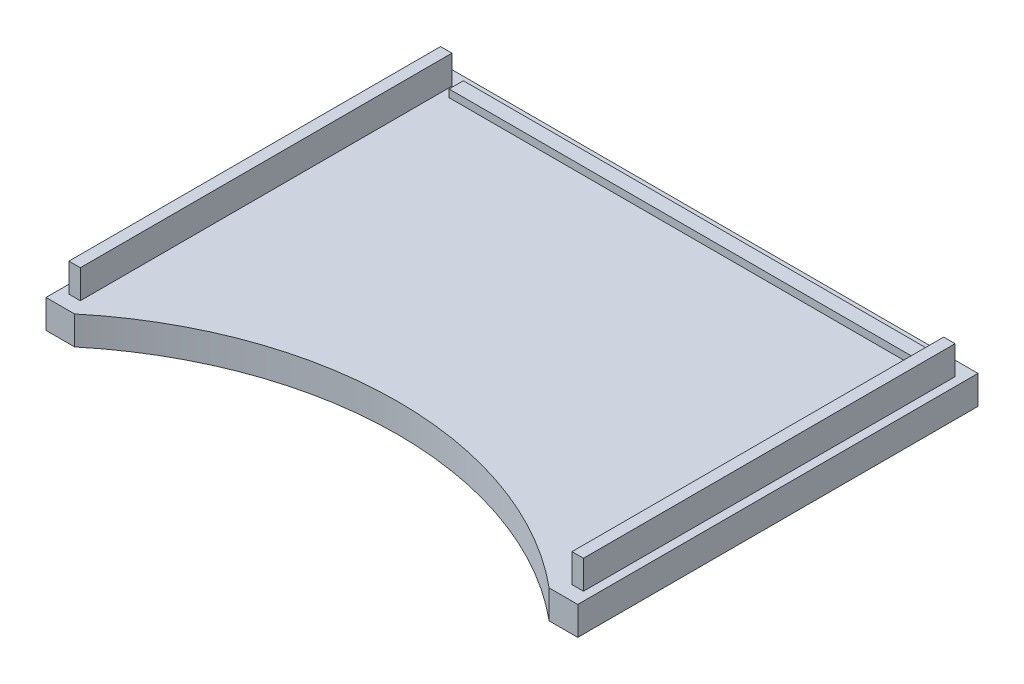
ISO-10303-21;
HEADER;
FILE_DESCRIPTION(('STEP AP214'),'2;1');
FILE_NAME('part.step','',(''),(''),'','','');
FILE_SCHEMA(('AUTOMOTIVE_DESIGN { 1 0 10303 214 1 1 1 1 }'));
ENDSEC;
DATA;
#1=APPLICATION_CONTEXT('core data for automotive mechanical design processes');
#2=APPLICATION_PROTOCOL_DEFINITION('international standard','automotive_design',2000,#1);
#3=PRODUCT_CONTEXT('',#1,'mechanical');
#4=PRODUCT('Part','Part','',(#3));
#5=PRODUCT_RELATED_PRODUCT_CATEGORY('part','',(#4));
#6=PRODUCT_DEFINITION_FORMATION('','',#4);
#7=PRODUCT_DEFINITION_CONTEXT('part definition',#1,'design');
#8=PRODUCT_DEFINITION('design','',#6,#7);
#9=PRODUCT_DEFINITION_SHAPE('','',#8);
#10=(LENGTH_UNIT() NAMED_UNIT(*) SI_UNIT(.MILLI.,.METRE.));
#11=(NAMED_UNIT(*) PLANE_ANGLE_UNIT() SI_UNIT($,.RADIAN.));
#12=(NAMED_UNIT(*) SI_UNIT($,.STERADIAN.) SOLID_ANGLE_UNIT());
#13=UNCERTAINTY_MEASURE_WITH_UNIT(LENGTH_MEASURE(1.E-05),#10,'distance_accuracy_value','');
#14=(GEOMETRIC_REPRESENTATION_CONTEXT(3) GLOBAL_UNCERTAINTY_ASSIGNED_CONTEXT((#13)) GLOBAL_UNIT_ASSIGNED_CONTEXT((#10,
#11,#12)) REPRESENTATION_CONTEXT('',''));
#15=CARTESIAN_POINT('',(0.,0.,0.));
#16=DIRECTION('',(0.,0.,1.));
#17=DIRECTION('',(1.,0.,0.));
#18=AXIS2_PLACEMENT_3D('',#15,#16,#17);
#19=CARTESIAN_POINT('',(0.,10.,0.));
#20=DIRECTION('',(0.,-1.,0.));
#21=DIRECTION('',(0.,0.,-1.));
#22=AXIS2_PLACEMENT_3D('',#19,#20,#21);
#23=PLANE('',#22);
#24=DIRECTION('',(0.,0.,1.));
#25=VECTOR('',#24,1.);
#26=CARTESIAN_POINT('',(179.,10.,-135.));
#27=LINE('',#26,#25);
#28=CARTESIAN_POINT('',(179.,10.,-135.));
#29=VERTEX_POINT('',#28);
#30=CARTESIAN_POINT('',(179.,10.,-5.));
#31=VERTEX_POINT('',#30);
#32=EDGE_CURVE('E181',#29,#31,#27,.T.);
#33=ORIENTED_EDGE('',*,*,#32,.F.);
#34=DIRECTION('',(-1.,0.,0.));
#35=VECTOR('',#34,1.);
#36=CARTESIAN_POINT('',(179.,10.,-135.));
#37=LINE('',#36,#35);
#38=CARTESIAN_POINT('',(183.,10.,-135.));
#39=VERTEX_POINT('',#38);
#40=EDGE_CURVE('E194',#39,#29,#37,.T.);
#41=ORIENTED_EDGE('',*,*,#40,.F.);
#42=DIRECTION('',(0.,0.,-1.));
#43=VECTOR('',#42,1.);
#44=CARTESIAN_POINT('',(183.,10.,-135.));
#45=LINE('',#44,#43);
#46=CARTESIAN_POINT('',(183.,10.,-5.));
#47=VERTEX_POINT('',#46);
#48=EDGE_CURVE('E203',#47,#39,#45,.T.);
#49=ORIENTED_EDGE('',*,*,#48,.F.);
#50=DIRECTION('',(1.,0.,0.));
#51=VECTOR('',#50,1.);
#52=CARTESIAN_POINT('',(179.,10.,-5.));
#53=LINE('',#52,#51);
#54=EDGE_CURVE('E184',#31,#47,#53,.T.);
#55=ORIENTED_EDGE('',*,*,#54,.F.);
#56=EDGE_LOOP('',(#33,#41,#49,#55));
#57=FACE_BOUND('',#56,.T.);
#58=DIRECTION('',(1.,0.,0.));
#59=VECTOR('',#58,1.);
#60=CARTESIAN_POINT('',(0.,10.,0.));
#61=LINE('',#60,#59);
#62=CARTESIAN_POINT('',(0.,10.,0.));
#63=VERTEX_POINT('',#62);
#64=CARTESIAN_POINT('',(10.,10.,0.));
#65=VERTEX_POINT('',#64);
#66=EDGE_CURVE('E268',#63,#65,#61,.T.);
#67=ORIENTED_EDGE('',*,*,#66,.T.);
#68=CARTESIAN_POINT('',(93.,10.,99.8166666666667));
#69=DIRECTION('',(0.,1.,0.));
#70=DIRECTION('',(0.,0.,-1.));
#71=AXIS2_PLACEMENT_3D('',#68,#69,#70);
#72=CIRCLE('',#71,129.816666666667);
#73=CARTESIAN_POINT('',(176.,10.,0.));
#74=VERTEX_POINT('',#73);
#75=EDGE_CURVE('E252',#74,#65,#72,.T.);
#76=ORIENTED_EDGE('',*,*,#75,.F.);
#77=CARTESIAN_POINT('',(186.,10.,0.));
#78=VERTEX_POINT('',#77);
#79=EDGE_CURVE('E266',#74,#78,#61,.T.);
#80=ORIENTED_EDGE('',*,*,#79,.T.);
#81=DIRECTION('',(0.,0.,-1.));
#82=VECTOR('',#81,1.);
#83=CARTESIAN_POINT('',(186.,10.,0.));
#84=LINE('',#83,#82);
#85=CARTESIAN_POINT('',(186.,10.,-140.));
#86=VERTEX_POINT('',#85);
#87=EDGE_CURVE('E271',#78,#86,#84,.T.);
#88=ORIENTED_EDGE('',*,*,#87,.T.);
#89=DIRECTION('',(-1.,0.,0.));
#90=VECTOR('',#89,1.);
#91=CARTESIAN_POINT('',(0.,10.,-140.));
#92=LINE('',#91,#90);
#93=CARTESIAN_POINT('',(0.,10.,-140.));
#94=VERTEX_POINT('',#93);
#95=EDGE_CURVE('E273',#86,#94,#92,.T.);
#96=ORIENTED_EDGE('',*,*,#95,.T.);
#97=DIRECTION('',(0.,0.,1.));
#98=VECTOR('',#97,1.);
#99=CARTESIAN_POINT('',(0.,10.,0.));
#100=LINE('',#99,#98);
#101=EDGE_CURVE('E263',#94,#63,#100,.T.);
#102=ORIENTED_EDGE('',*,*,#101,.T.);
#103=EDGE_LOOP('',(#67,#76,#80,#88,#96,#102));
#104=FACE_BOUND('',#103,.T.);
#105=DIRECTION('',(0.,0.,1.));
#106=VECTOR('',#105,1.);
#107=CARTESIAN_POINT('',(10.,10.,-136.));
#108=LINE('',#107,#106);
#109=CARTESIAN_POINT('',(10.,10.,-136.));
#110=VERTEX_POINT('',#109);
#111=CARTESIAN_POINT('',(10.,10.,-131.));
#112=VERTEX_POINT('',#111);
#113=EDGE_CURVE('E219',#110,#112,#108,.T.);
#114=ORIENTED_EDGE('',*,*,#113,.F.);
#115=DIRECTION('',(-1.,0.,0.));
#116=VECTOR('',#115,1.);
#117=CARTESIAN_POINT('',(10.,10.,-136.));
#118=LINE('',#117,#116);
#119=CARTESIAN_POINT('',(176.,10.,-136.));
#120=VERTEX_POINT('',#119);
#121=EDGE_CURVE('E224',#120,#110,#118,.T.);
#122=ORIENTED_EDGE('',*,*,#121,.F.);
#123=DIRECTION('',(0.,0.,-1.));
#124=VECTOR('',#123,1.);
#125=CARTESIAN_POINT('',(176.,10.,-136.));
#126=LINE('',#125,#124);
#127=CARTESIAN_POINT('',(176.,10.,-131.));
#128=VERTEX_POINT('',#127);
#129=EDGE_CURVE('E236',#128,#120,#126,.T.);
#130=ORIENTED_EDGE('',*,*,#129,.F.);
#131=DIRECTION('',(1.,0.,0.));
#132=VECTOR('',#131,1.);
#133=CARTESIAN_POINT('',(10.,10.,-131.));
#134=LINE('',#133,#132);
#135=EDGE_CURVE('E233',#112,#128,#134,.T.);
#136=ORIENTED_EDGE('',*,*,#135,.F.);
#137=EDGE_LOOP('',(#114,#122,#130,#136));
#138=FACE_BOUND('',#137,.T.);
#139=DIRECTION('',(0.,0.,1.));
#140=VECTOR('',#139,1.);
#141=CARTESIAN_POINT('',(3.,10.,-135.));
#142=LINE('',#141,#140);
#143=CARTESIAN_POINT('',(3.,10.,-135.));
#144=VERTEX_POINT('',#143);
#145=CARTESIAN_POINT('',(3.00000000000002,10.,-5.));
#146=VERTEX_POINT('',#145);
#147=EDGE_CURVE('E180',#144,#146,#142,.T.);
#148=ORIENTED_EDGE('',*,*,#147,.F.);
#149=DIRECTION('',(-1.,0.,0.));
#150=VECTOR('',#149,1.);
#151=CARTESIAN_POINT('',(3.,10.,-135.));
#152=LINE('',#151,#150);
#153=CARTESIAN_POINT('',(7.,10.,-135.));
#154=VERTEX_POINT('',#153);
#155=EDGE_CURVE('E177',#154,#144,#152,.T.);
#156=ORIENTED_EDGE('',*,*,#155,.F.);
#157=DIRECTION('',(0.,0.,-1.));
#158=VECTOR('',#157,1.);
#159=CARTESIAN_POINT('',(7.,10.,-135.));
#160=LINE('',#159,#158);
#161=CARTESIAN_POINT('',(7.00000000000002,10.,-5.));
#162=VERTEX_POINT('',#161);
#163=EDGE_CURVE('E55',#162,#154,#160,.T.);
#164=ORIENTED_EDGE('',*,*,#163,.F.);
#165=DIRECTION('',(1.,0.,0.));
#166=VECTOR('',#165,1.);
#167=CARTESIAN_POINT('',(3.00000000000002,10.,-5.));
#168=LINE('',#167,#166);
#169=EDGE_CURVE('E50',#146,#162,#168,.T.);
#170=ORIENTED_EDGE('',*,*,#169,.F.);
#171=EDGE_LOOP('',(#148,#156,#164,#170));
#172=FACE_BOUND('',#171,.T.);
#173=ADVANCED_FACE('F35',(#57,#104,#138,#172),#23,.F.);
#174=CARTESIAN_POINT('',(0.,10.,0.));
#175=DIRECTION('',(0.,0.,-1.));
#176=DIRECTION('',(-1.,0.,0.));
#177=AXIS2_PLACEMENT_3D('',#174,#175,#176);
#178=PLANE('',#177);
#179=DIRECTION('',(1.,0.,0.));
#180=VECTOR('',#179,1.);
#181=CARTESIAN_POINT('',(0.,0.,0.));
#182=LINE('',#181,#180);
#183=CARTESIAN_POINT('',(0.,0.,0.));
#184=VERTEX_POINT('',#183);
#185=CARTESIAN_POINT('',(10.,0.,0.));
#186=VERTEX_POINT('',#185);
#187=EDGE_CURVE('E279',#184,#186,#182,.T.);
#188=ORIENTED_EDGE('',*,*,#187,.T.);
#189=DIRECTION('',(0.,1.,0.));
#190=VECTOR('',#189,1.);
#191=CARTESIAN_POINT('',(10.,0.,0.));
#192=LINE('',#191,#190);
#193=EDGE_CURVE('E256',#186,#65,#192,.T.);
#194=ORIENTED_EDGE('',*,*,#193,.T.);
#195=ORIENTED_EDGE('',*,*,#66,.F.);
#196=DIRECTION('',(0.,-1.,0.));
#197=VECTOR('',#196,1.);
#198=CARTESIAN_POINT('',(0.,10.,0.));
#199=LINE('',#198,#197);
#200=EDGE_CURVE('E11',#63,#184,#199,.T.);
#201=ORIENTED_EDGE('',*,*,#200,.T.);
#202=EDGE_LOOP('',(#188,#194,#195,#201));
#203=FACE_BOUND('',#202,.T.);
#204=ADVANCED_FACE('F318',(#203),#178,.F.);
#205=CARTESIAN_POINT('',(0.,10.,0.));
#206=DIRECTION('',(1.,0.,0.));
#207=DIRECTION('',(0.,0.,-1.));
#208=AXIS2_PLACEMENT_3D('',#205,#206,#207);
#209=PLANE('',#208);
#210=DIRECTION('',(0.,0.,1.));
#211=VECTOR('',#210,1.);
#212=CARTESIAN_POINT('',(0.,0.,0.));
#213=LINE('',#212,#211);
#214=CARTESIAN_POINT('',(0.,0.,-140.));
#215=VERTEX_POINT('',#214);
#216=EDGE_CURVE('E260',#215,#184,#213,.T.);
#217=ORIENTED_EDGE('',*,*,#216,.T.);
#218=ORIENTED_EDGE('',*,*,#200,.F.);
#219=ORIENTED_EDGE('',*,*,#101,.F.);
#220=DIRECTION('',(0.,-1.,0.));
#221=VECTOR('',#220,1.);
#222=CARTESIAN_POINT('',(0.,10.,-140.));
#223=LINE('',#222,#221);
#224=EDGE_CURVE('E275',#94,#215,#223,.T.);
#225=ORIENTED_EDGE('',*,*,#224,.T.);
#226=EDGE_LOOP('',(#217,#218,#219,#225));
#227=FACE_BOUND('',#226,.T.);
#228=ADVANCED_FACE('F37',(#227),#209,.F.);
#229=ORIENTED_EDGE('',*,*,#79,.F.);
#230=DIRECTION('',(0.,1.,0.));
#231=VECTOR('',#230,1.);
#232=CARTESIAN_POINT('',(176.,0.,0.));
#233=LINE('',#232,#231);
#234=CARTESIAN_POINT('',(176.,0.,0.));
#235=VERTEX_POINT('',#234);
#236=EDGE_CURVE('E258',#235,#74,#233,.T.);
#237=ORIENTED_EDGE('',*,*,#236,.F.);
#238=CARTESIAN_POINT('',(186.,0.,0.));
#239=VERTEX_POINT('',#238);
#240=EDGE_CURVE('E278',#235,#239,#182,.T.);
#241=ORIENTED_EDGE('',*,*,#240,.T.);
#242=DIRECTION('',(0.,-1.,0.));
#243=VECTOR('',#242,1.);
#244=CARTESIAN_POINT('',(186.,10.,0.));
#245=LINE('',#244,#243);
#246=EDGE_CURVE('E43',#78,#239,#245,.T.);
#247=ORIENTED_EDGE('',*,*,#246,.F.);
#248=EDGE_LOOP('',(#229,#237,#241,#247));
#249=FACE_BOUND('',#248,.T.);
#250=ADVANCED_FACE('F314',(#249),#178,.F.);
#251=CARTESIAN_POINT('',(186.,10.,0.));
#252=DIRECTION('',(-1.,0.,0.));
#253=DIRECTION('',(0.,0.,1.));
#254=AXIS2_PLACEMENT_3D('',#251,#252,#253);
#255=PLANE('',#254);
#256=DIRECTION('',(0.,0.,-1.));
#257=VECTOR('',#256,1.);
#258=CARTESIAN_POINT('',(186.,0.,0.));
#259=LINE('',#258,#257);
#260=CARTESIAN_POINT('',(186.,0.,-140.));
#261=VERTEX_POINT('',#260);
#262=EDGE_CURVE('E282',#239,#261,#259,.T.);
#263=ORIENTED_EDGE('',*,*,#262,.T.);
#264=DIRECTION('',(0.,-1.,0.));
#265=VECTOR('',#264,1.);
#266=CARTESIAN_POINT('',(186.,10.,-140.));
#267=LINE('',#266,#265);
#268=EDGE_CURVE('E287',#86,#261,#267,.T.);
#269=ORIENTED_EDGE('',*,*,#268,.F.);
#270=ORIENTED_EDGE('',*,*,#87,.F.);
#271=ORIENTED_EDGE('',*,*,#246,.T.);
#272=EDGE_LOOP('',(#263,#269,#270,#271));
#273=FACE_BOUND('',#272,.T.);
#274=ADVANCED_FACE('F294',(#273),#255,.F.);
#275=CARTESIAN_POINT('',(0.,10.,-140.));
#276=DIRECTION('',(0.,0.,1.));
#277=DIRECTION('',(1.,0.,0.));
#278=AXIS2_PLACEMENT_3D('',#275,#276,#277);
#279=PLANE('',#278);
#280=DIRECTION('',(-1.,0.,0.));
#281=VECTOR('',#280,1.);
#282=CARTESIAN_POINT('',(0.,0.,-140.));
#283=LINE('',#282,#281);
#284=EDGE_CURVE('E267',#261,#215,#283,.T.);
#285=ORIENTED_EDGE('',*,*,#284,.T.);
#286=ORIENTED_EDGE('',*,*,#224,.F.);
#287=ORIENTED_EDGE('',*,*,#95,.F.);
#288=ORIENTED_EDGE('',*,*,#268,.T.);
#289=EDGE_LOOP('',(#285,#286,#287,#288));
#290=FACE_BOUND('',#289,.T.);
#291=ADVANCED_FACE('F305',(#290),#279,.F.);
#292=CARTESIAN_POINT('',(0.,0.,0.));
#293=DIRECTION('',(0.,-1.,0.));
#294=DIRECTION('',(0.,0.,-1.));
#295=AXIS2_PLACEMENT_3D('',#292,#293,#294);
#296=PLANE('',#295);
#297=CARTESIAN_POINT('',(93.,0.,99.8166666666667));
#298=DIRECTION('',(0.,1.,0.));
#299=DIRECTION('',(0.,0.,-1.));
#300=AXIS2_PLACEMENT_3D('',#297,#298,#299);
#301=CIRCLE('',#300,129.816666666667);
#302=EDGE_CURVE('E253',#235,#186,#301,.T.);
#303=ORIENTED_EDGE('',*,*,#302,.T.);
#304=ORIENTED_EDGE('',*,*,#187,.F.);
#305=ORIENTED_EDGE('',*,*,#216,.F.);
#306=ORIENTED_EDGE('',*,*,#284,.F.);
#307=ORIENTED_EDGE('',*,*,#262,.F.);
#308=ORIENTED_EDGE('',*,*,#240,.F.);
#309=EDGE_LOOP('',(#303,#304,#305,#306,#307,#308));
#310=FACE_BOUND('',#309,.T.);
#311=ADVANCED_FACE('F301',(#310),#296,.T.);
#312=CARTESIAN_POINT('',(93.,0.,99.8166666666667));
#313=DIRECTION('',(0.,1.,0.));
#314=DIRECTION('',(0.,0.,1.));
#315=AXIS2_PLACEMENT_3D('',#312,#313,#314);
#316=CYLINDRICAL_SURFACE('',#315,129.816666666667);
#317=ORIENTED_EDGE('',*,*,#75,.T.);
#318=ORIENTED_EDGE('',*,*,#193,.F.);
#319=ORIENTED_EDGE('',*,*,#302,.F.);
#320=ORIENTED_EDGE('',*,*,#236,.T.);
#321=EDGE_LOOP('',(#317,#318,#319,#320));
#322=FACE_BOUND('',#321,.T.);
#323=ADVANCED_FACE('F316',(#322),#316,.F.);
#324=CARTESIAN_POINT('',(10.,12.6416,-136.));
#325=DIRECTION('',(1.,0.,0.));
#326=DIRECTION('',(0.,0.,-1.));
#327=AXIS2_PLACEMENT_3D('',#324,#325,#326);
#328=PLANE('',#327);
#329=ORIENTED_EDGE('',*,*,#113,.T.);
#330=DIRECTION('',(0.,-1.,0.));
#331=VECTOR('',#330,1.);
#332=CARTESIAN_POINT('',(10.,12.6416,-131.));
#333=LINE('',#332,#331);
#334=CARTESIAN_POINT('',(10.,12.6416,-131.));
#335=VERTEX_POINT('',#334);
#336=EDGE_CURVE('E249',#335,#112,#333,.T.);
#337=ORIENTED_EDGE('',*,*,#336,.F.);
#338=DIRECTION('',(0.,0.,1.));
#339=VECTOR('',#338,1.);
#340=CARTESIAN_POINT('',(10.,12.6416,-136.));
#341=LINE('',#340,#339);
#342=CARTESIAN_POINT('',(10.,12.6416,-136.));
#343=VERTEX_POINT('',#342);
#344=EDGE_CURVE('E220',#343,#335,#341,.T.);
#345=ORIENTED_EDGE('',*,*,#344,.F.);
#346=DIRECTION('',(0.,-1.,0.));
#347=VECTOR('',#346,1.);
#348=CARTESIAN_POINT('',(10.,12.6416,-136.));
#349=LINE('',#348,#347);
#350=EDGE_CURVE('E230',#343,#110,#349,.T.);
#351=ORIENTED_EDGE('',*,*,#350,.T.);
#352=EDGE_LOOP('',(#329,#337,#345,#351));
#353=FACE_BOUND('',#352,.T.);
#354=ADVANCED_FACE('F340',(#353),#328,.F.);
#355=CARTESIAN_POINT('',(10.,12.6416,-131.));
#356=DIRECTION('',(0.,0.,-1.));
#357=DIRECTION('',(-1.,0.,0.));
#358=AXIS2_PLACEMENT_3D('',#355,#356,#357);
#359=PLANE('',#358);
#360=ORIENTED_EDGE('',*,*,#135,.T.);
#361=DIRECTION('',(0.,-1.,0.));
#362=VECTOR('',#361,1.);
#363=CARTESIAN_POINT('',(176.,12.6416,-131.));
#364=LINE('',#363,#362);
#365=CARTESIAN_POINT('',(176.,12.6416,-131.));
#366=VERTEX_POINT('',#365);
#367=EDGE_CURVE('E246',#366,#128,#364,.T.);
#368=ORIENTED_EDGE('',*,*,#367,.F.);
#369=DIRECTION('',(1.,0.,0.));
#370=VECTOR('',#369,1.);
#371=CARTESIAN_POINT('',(10.,12.6416,-131.));
#372=LINE('',#371,#370);
#373=EDGE_CURVE('E223',#335,#366,#372,.T.);
#374=ORIENTED_EDGE('',*,*,#373,.F.);
#375=ORIENTED_EDGE('',*,*,#336,.T.);
#376=EDGE_LOOP('',(#360,#368,#374,#375));
#377=FACE_BOUND('',#376,.T.);
#378=ADVANCED_FACE('F343',(#377),#359,.F.);
#379=CARTESIAN_POINT('',(176.,12.6416,-136.));
#380=DIRECTION('',(-1.,0.,0.));
#381=DIRECTION('',(0.,0.,1.));
#382=AXIS2_PLACEMENT_3D('',#379,#380,#381);
#383=PLANE('',#382);
#384=ORIENTED_EDGE('',*,*,#129,.T.);
#385=DIRECTION('',(0.,-1.,0.));
#386=VECTOR('',#385,1.);
#387=CARTESIAN_POINT('',(176.,12.6416,-136.));
#388=LINE('',#387,#386);
#389=CARTESIAN_POINT('',(176.,12.6416,-136.));
#390=VERTEX_POINT('',#389);
#391=EDGE_CURVE('E243',#390,#120,#388,.T.);
#392=ORIENTED_EDGE('',*,*,#391,.F.);
#393=DIRECTION('',(0.,0.,-1.));
#394=VECTOR('',#393,1.);
#395=CARTESIAN_POINT('',(176.,12.6416,-136.));
#396=LINE('',#395,#394);
#397=EDGE_CURVE('E226',#366,#390,#396,.T.);
#398=ORIENTED_EDGE('',*,*,#397,.F.);
#399=ORIENTED_EDGE('',*,*,#367,.T.);
#400=EDGE_LOOP('',(#384,#392,#398,#399));
#401=FACE_BOUND('',#400,.T.);
#402=ADVANCED_FACE('F347',(#401),#383,.F.);
#403=CARTESIAN_POINT('',(10.,12.6416,-136.));
#404=DIRECTION('',(0.,0.,1.));
#405=DIRECTION('',(1.,0.,0.));
#406=AXIS2_PLACEMENT_3D('',#403,#404,#405);
#407=PLANE('',#406);
#408=ORIENTED_EDGE('',*,*,#121,.T.);
#409=ORIENTED_EDGE('',*,*,#350,.F.);
#410=DIRECTION('',(-1.,0.,0.));
#411=VECTOR('',#410,1.);
#412=CARTESIAN_POINT('',(10.,12.6416,-136.));
#413=LINE('',#412,#411);
#414=EDGE_CURVE('E228',#390,#343,#413,.T.);
#415=ORIENTED_EDGE('',*,*,#414,.F.);
#416=ORIENTED_EDGE('',*,*,#391,.T.);
#417=EDGE_LOOP('',(#408,#409,#415,#416));
#418=FACE_BOUND('',#417,.T.);
#419=ADVANCED_FACE('F351',(#418),#407,.F.);
#420=CARTESIAN_POINT('',(0.,12.6416,0.));
#421=DIRECTION('',(0.,1.,0.));
#422=DIRECTION('',(0.,0.,1.));
#423=AXIS2_PLACEMENT_3D('',#420,#421,#422);
#424=PLANE('',#423);
#425=ORIENTED_EDGE('',*,*,#344,.T.);
#426=ORIENTED_EDGE('',*,*,#373,.T.);
#427=ORIENTED_EDGE('',*,*,#397,.T.);
#428=ORIENTED_EDGE('',*,*,#414,.T.);
#429=EDGE_LOOP('',(#425,#426,#427,#428));
#430=FACE_BOUND('',#429,.T.);
#431=ADVANCED_FACE('F355',(#430),#424,.T.);
#432=CARTESIAN_POINT('',(179.,20.,-135.));
#433=DIRECTION('',(1.,0.,0.));
#434=DIRECTION('',(0.,0.,-1.));
#435=AXIS2_PLACEMENT_3D('',#432,#433,#434);
#436=PLANE('',#435);
#437=ORIENTED_EDGE('',*,*,#32,.T.);
#438=DIRECTION('',(0.,-1.,0.));
#439=VECTOR('',#438,1.);
#440=CARTESIAN_POINT('',(179.,20.,-5.));
#441=LINE('',#440,#439);
#442=CARTESIAN_POINT('',(179.,20.,-5.));
#443=VERTEX_POINT('',#442);
#444=EDGE_CURVE('E216',#443,#31,#441,.T.);
#445=ORIENTED_EDGE('',*,*,#444,.F.);
#446=DIRECTION('',(0.,0.,1.));
#447=VECTOR('',#446,1.);
#448=CARTESIAN_POINT('',(179.,20.,-135.));
#449=LINE('',#448,#447);
#450=CARTESIAN_POINT('',(179.,20.,-135.));
#451=VERTEX_POINT('',#450);
#452=EDGE_CURVE('E190',#451,#443,#449,.T.);
#453=ORIENTED_EDGE('',*,*,#452,.F.);
#454=DIRECTION('',(0.,-1.,0.));
#455=VECTOR('',#454,1.);
#456=CARTESIAN_POINT('',(179.,20.,-135.));
#457=LINE('',#456,#455);
#458=EDGE_CURVE('E199',#451,#29,#457,.T.);
#459=ORIENTED_EDGE('',*,*,#458,.T.);
#460=EDGE_LOOP('',(#437,#445,#453,#459));
#461=FACE_BOUND('',#460,.T.);
#462=ADVANCED_FACE('F359',(#461),#436,.F.);
#463=CARTESIAN_POINT('',(179.,20.,-5.));
#464=DIRECTION('',(0.,0.,-1.));
#465=DIRECTION('',(-1.,0.,0.));
#466=AXIS2_PLACEMENT_3D('',#463,#464,#465);
#467=PLANE('',#466);
#468=ORIENTED_EDGE('',*,*,#54,.T.);
#469=DIRECTION('',(0.,-1.,0.));
#470=VECTOR('',#469,1.);
#471=CARTESIAN_POINT('',(183.,20.,-5.));
#472=LINE('',#471,#470);
#473=CARTESIAN_POINT('',(183.,20.,-5.));
#474=VERTEX_POINT('',#473);
#475=EDGE_CURVE('E213',#474,#47,#472,.T.);
#476=ORIENTED_EDGE('',*,*,#475,.F.);
#477=DIRECTION('',(1.,0.,0.));
#478=VECTOR('',#477,1.);
#479=CARTESIAN_POINT('',(179.,20.,-5.));
#480=LINE('',#479,#478);
#481=EDGE_CURVE('E193',#443,#474,#480,.T.);
#482=ORIENTED_EDGE('',*,*,#481,.F.);
#483=ORIENTED_EDGE('',*,*,#444,.T.);
#484=EDGE_LOOP('',(#468,#476,#482,#483));
#485=FACE_BOUND('',#484,.T.);
#486=ADVANCED_FACE('F363',(#485),#467,.F.);
#487=CARTESIAN_POINT('',(183.,20.,-135.));
#488=DIRECTION('',(-1.,0.,0.));
#489=DIRECTION('',(0.,0.,1.));
#490=AXIS2_PLACEMENT_3D('',#487,#488,#489);
#491=PLANE('',#490);
#492=ORIENTED_EDGE('',*,*,#48,.T.);
#493=DIRECTION('',(0.,-1.,0.));
#494=VECTOR('',#493,1.);
#495=CARTESIAN_POINT('',(183.,20.,-135.));
#496=LINE('',#495,#494);
#497=CARTESIAN_POINT('',(183.,20.,-135.));
#498=VERTEX_POINT('',#497);
#499=EDGE_CURVE('E210',#498,#39,#496,.T.);
#500=ORIENTED_EDGE('',*,*,#499,.F.);
#501=DIRECTION('',(0.,0.,-1.));
#502=VECTOR('',#501,1.);
#503=CARTESIAN_POINT('',(183.,20.,-135.));
#504=LINE('',#503,#502);
#505=EDGE_CURVE('E196',#474,#498,#504,.T.);
#506=ORIENTED_EDGE('',*,*,#505,.F.);
#507=ORIENTED_EDGE('',*,*,#475,.T.);
#508=EDGE_LOOP('',(#492,#500,#506,#507));
#509=FACE_BOUND('',#508,.T.);
#510=ADVANCED_FACE('F367',(#509),#491,.F.);
#511=CARTESIAN_POINT('',(179.,20.,-135.));
#512=DIRECTION('',(0.,0.,1.));
#513=DIRECTION('',(1.,0.,0.));
#514=AXIS2_PLACEMENT_3D('',#511,#512,#513);
#515=PLANE('',#514);
#516=ORIENTED_EDGE('',*,*,#40,.T.);
#517=ORIENTED_EDGE('',*,*,#458,.F.);
#518=DIRECTION('',(-1.,0.,0.));
#519=VECTOR('',#518,1.);
#520=CARTESIAN_POINT('',(179.,20.,-135.));
#521=LINE('',#520,#519);
#522=EDGE_CURVE('E198',#498,#451,#521,.T.);
#523=ORIENTED_EDGE('',*,*,#522,.F.);
#524=ORIENTED_EDGE('',*,*,#499,.T.);
#525=EDGE_LOOP('',(#516,#517,#523,#524));
#526=FACE_BOUND('',#525,.T.);
#527=ADVANCED_FACE('F371',(#526),#515,.F.);
#528=CARTESIAN_POINT('',(0.,20.,0.));
#529=DIRECTION('',(0.,1.,0.));
#530=DIRECTION('',(0.,0.,1.));
#531=AXIS2_PLACEMENT_3D('',#528,#529,#530);
#532=PLANE('',#531);
#533=ORIENTED_EDGE('',*,*,#452,.T.);
#534=ORIENTED_EDGE('',*,*,#481,.T.);
#535=ORIENTED_EDGE('',*,*,#505,.T.);
#536=ORIENTED_EDGE('',*,*,#522,.T.);
#537=EDGE_LOOP('',(#533,#534,#535,#536));
#538=FACE_BOUND('',#537,.T.);
#539=ADVANCED_FACE('F375',(#538),#532,.T.);
#540=CARTESIAN_POINT('',(3.,20.,-135.));
#541=DIRECTION('',(1.,0.,0.));
#542=DIRECTION('',(0.,0.,-1.));
#543=AXIS2_PLACEMENT_3D('',#540,#541,#542);
#544=PLANE('',#543);
#545=ORIENTED_EDGE('',*,*,#147,.T.);
#546=DIRECTION('',(0.,-1.,0.));
#547=VECTOR('',#546,1.);
#548=CARTESIAN_POINT('',(3.00000000000002,20.,-5.));
#549=LINE('',#548,#547);
#550=CARTESIAN_POINT('',(3.00000000000002,20.,-5.));
#551=VERTEX_POINT('',#550);
#552=EDGE_CURVE('E161',#551,#146,#549,.T.);
#553=ORIENTED_EDGE('',*,*,#552,.F.);
#554=DIRECTION('',(0.,0.,1.));
#555=VECTOR('',#554,1.);
#556=CARTESIAN_POINT('',(3.,20.,-135.));
#557=LINE('',#556,#555);
#558=CARTESIAN_POINT('',(3.,20.,-135.));
#559=VERTEX_POINT('',#558);
#560=EDGE_CURVE('E168',#559,#551,#557,.T.);
#561=ORIENTED_EDGE('',*,*,#560,.F.);
#562=DIRECTION('',(0.,-1.,0.));
#563=VECTOR('',#562,1.);
#564=CARTESIAN_POINT('',(3.,20.,-135.));
#565=LINE('',#564,#563);
#566=EDGE_CURVE('E527',#559,#144,#565,.T.);
#567=ORIENTED_EDGE('',*,*,#566,.T.);
#568=EDGE_LOOP('',(#545,#553,#561,#567));
#569=FACE_BOUND('',#568,.T.);
#570=ADVANCED_FACE('F179',(#569),#544,.F.);
#571=CARTESIAN_POINT('',(3.00000000000002,20.,-5.));
#572=DIRECTION('',(0.,0.,-1.));
#573=DIRECTION('',(-1.,0.,0.));
#574=AXIS2_PLACEMENT_3D('',#571,#572,#573);
#575=PLANE('',#574);
#576=ORIENTED_EDGE('',*,*,#169,.T.);
#577=DIRECTION('',(0.,-1.,0.));
#578=VECTOR('',#577,1.);
#579=CARTESIAN_POINT('',(7.00000000000002,20.,-5.));
#580=LINE('',#579,#578);
#581=CARTESIAN_POINT('',(7.00000000000002,20.,-5.));
#582=VERTEX_POINT('',#581);
#583=EDGE_CURVE('E164',#582,#162,#580,.T.);
#584=ORIENTED_EDGE('',*,*,#583,.F.);
#585=DIRECTION('',(1.,0.,0.));
#586=VECTOR('',#585,1.);
#587=CARTESIAN_POINT('',(3.00000000000002,20.,-5.));
#588=LINE('',#587,#586);
#589=EDGE_CURVE('E157',#551,#582,#588,.T.);
#590=ORIENTED_EDGE('',*,*,#589,.F.);
#591=ORIENTED_EDGE('',*,*,#552,.T.);
#592=EDGE_LOOP('',(#576,#584,#590,#591));
#593=FACE_BOUND('',#592,.T.);
#594=ADVANCED_FACE('F159',(#593),#575,.F.);
#595=CARTESIAN_POINT('',(7.,20.,-135.));
#596=DIRECTION('',(-1.,0.,0.));
#597=DIRECTION('',(0.,0.,1.));
#598=AXIS2_PLACEMENT_3D('',#595,#596,#597);
#599=PLANE('',#598);
#600=ORIENTED_EDGE('',*,*,#163,.T.);
#601=DIRECTION('',(0.,-1.,0.));
#602=VECTOR('',#601,1.);
#603=CARTESIAN_POINT('',(7.,20.,-135.));
#604=LINE('',#603,#602);
#605=CARTESIAN_POINT('',(7.,20.,-135.));
#606=VERTEX_POINT('',#605);
#607=EDGE_CURVE('E186',#606,#154,#604,.T.);
#608=ORIENTED_EDGE('',*,*,#607,.F.);
#609=DIRECTION('',(0.,0.,-1.));
#610=VECTOR('',#609,1.);
#611=CARTESIAN_POINT('',(7.,20.,-135.));
#612=LINE('',#611,#610);
#613=EDGE_CURVE('E167',#582,#606,#612,.T.);
#614=ORIENTED_EDGE('',*,*,#613,.F.);
#615=ORIENTED_EDGE('',*,*,#583,.T.);
#616=EDGE_LOOP('',(#600,#608,#614,#615));
#617=FACE_BOUND('',#616,.T.);
#618=ADVANCED_FACE('F384',(#617),#599,.F.);
#619=CARTESIAN_POINT('',(3.,20.,-135.));
#620=DIRECTION('',(0.,0.,1.));
#621=DIRECTION('',(1.,0.,0.));
#622=AXIS2_PLACEMENT_3D('',#619,#620,#621);
#623=PLANE('',#622);
#624=ORIENTED_EDGE('',*,*,#155,.T.);
#625=ORIENTED_EDGE('',*,*,#566,.F.);
#626=DIRECTION('',(-1.,0.,0.));
#627=VECTOR('',#626,1.);
#628=CARTESIAN_POINT('',(3.,20.,-135.));
#629=LINE('',#628,#627);
#630=EDGE_CURVE('E173',#606,#559,#629,.T.);
#631=ORIENTED_EDGE('',*,*,#630,.F.);
#632=ORIENTED_EDGE('',*,*,#607,.T.);
#633=EDGE_LOOP('',(#624,#625,#631,#632));
#634=FACE_BOUND('',#633,.T.);
#635=ADVANCED_FACE('F387',(#634),#623,.F.);
#636=CARTESIAN_POINT('',(0.,20.,0.));
#637=DIRECTION('',(0.,1.,0.));
#638=DIRECTION('',(0.,0.,1.));
#639=AXIS2_PLACEMENT_3D('',#636,#637,#638);
#640=PLANE('',#639);
#641=ORIENTED_EDGE('',*,*,#560,.T.);
#642=ORIENTED_EDGE('',*,*,#589,.T.);
#643=ORIENTED_EDGE('',*,*,#613,.T.);
#644=ORIENTED_EDGE('',*,*,#630,.T.);
#645=EDGE_LOOP('',(#641,#642,#643,#644));
#646=FACE_BOUND('',#645,.T.);
#647=ADVANCED_FACE('F171',(#646),#640,.T.);
#648=CLOSED_SHELL('',(#173,#204,#228,#250,#274,#291,#311,#323,#354,#378,#402,#419,#431,#462,
#486,#510,#527,#539,#570,#594,#618,#635,#647));
#649=MANIFOLD_SOLID_BREP('B2',#648);
#650=ADVANCED_BREP_SHAPE_REPRESENTATION('',(#18,#649),#14);
#651=SHAPE_DEFINITION_REPRESENTATION(#9,#650);
ENDSEC;
END-ISO-10303-21;
